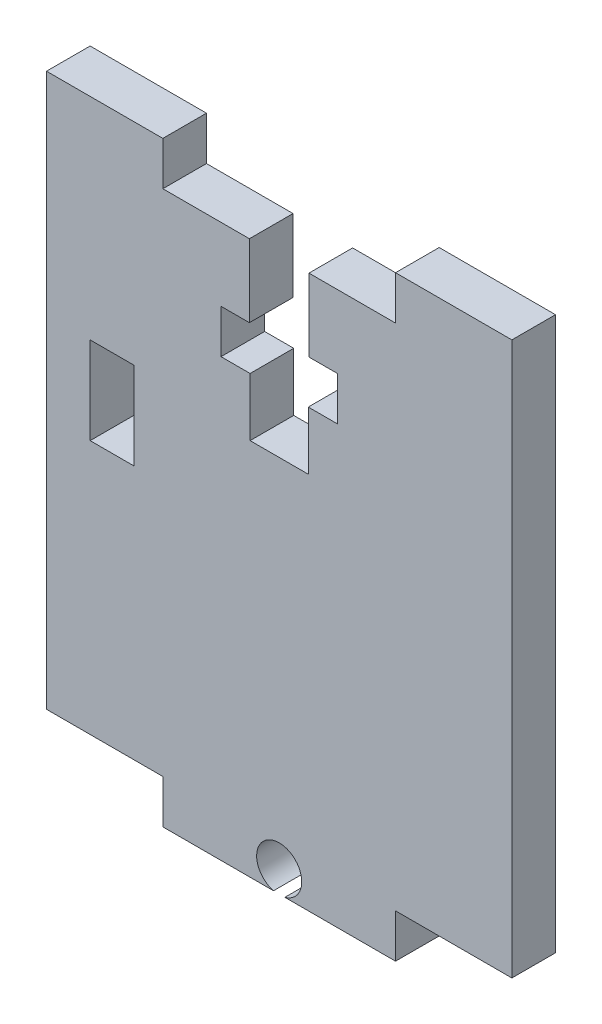
ISO-10303-21;
HEADER;
FILE_DESCRIPTION(('STEP AP214'),'2;1');
FILE_NAME('part.step','',(''),(''),'','','');
FILE_SCHEMA(('AUTOMOTIVE_DESIGN { 1 0 10303 214 1 1 1 1 }'));
ENDSEC;
DATA;
#1=APPLICATION_CONTEXT('core data for automotive mechanical design processes');
#2=APPLICATION_PROTOCOL_DEFINITION('international standard','automotive_design',2000,#1);
#3=PRODUCT_CONTEXT('',#1,'mechanical');
#4=PRODUCT('Part','Part','',(#3));
#5=PRODUCT_RELATED_PRODUCT_CATEGORY('part','',(#4));
#6=PRODUCT_DEFINITION_FORMATION('','',#4);
#7=PRODUCT_DEFINITION_CONTEXT('part definition',#1,'design');
#8=PRODUCT_DEFINITION('design','',#6,#7);
#9=PRODUCT_DEFINITION_SHAPE('','',#8);
#10=(LENGTH_UNIT() NAMED_UNIT(*) SI_UNIT(.MILLI.,.METRE.));
#11=(NAMED_UNIT(*) PLANE_ANGLE_UNIT() SI_UNIT($,.RADIAN.));
#12=(NAMED_UNIT(*) SI_UNIT($,.STERADIAN.) SOLID_ANGLE_UNIT());
#13=UNCERTAINTY_MEASURE_WITH_UNIT(LENGTH_MEASURE(1.E-05),#10,'distance_accuracy_value','');
#14=(GEOMETRIC_REPRESENTATION_CONTEXT(3) GLOBAL_UNCERTAINTY_ASSIGNED_CONTEXT((#13)) GLOBAL_UNIT_ASSIGNED_CONTEXT((#10,
#11,#12)) REPRESENTATION_CONTEXT('',''));
#15=CARTESIAN_POINT('',(0.,0.,0.));
#16=DIRECTION('',(0.,0.,1.));
#17=DIRECTION('',(1.,0.,0.));
#18=AXIS2_PLACEMENT_3D('',#15,#16,#17);
#19=CARTESIAN_POINT('',(0.,12.3553054771042,3.));
#20=DIRECTION('',(0.,0.,1.));
#21=DIRECTION('',(1.,0.,0.));
#22=AXIS2_PLACEMENT_3D('',#19,#20,#21);
#23=PLANE('',#22);
#24=DIRECTION('',(0.,-1.,0.));
#25=VECTOR('',#24,1.);
#26=CARTESIAN_POINT('',(8.,48.8553054771042,3.));
#27=LINE('',#26,#25);
#28=CARTESIAN_POINT('',(8.,51.8553054771042,3.));
#29=VERTEX_POINT('',#28);
#30=CARTESIAN_POINT('',(8.,48.8553054771042,3.));
#31=VERTEX_POINT('',#30);
#32=EDGE_CURVE('E266',#29,#31,#27,.T.);
#33=ORIENTED_EDGE('',*,*,#32,.T.);
#34=DIRECTION('',(-1.,0.,0.));
#35=VECTOR('',#34,1.);
#36=CARTESIAN_POINT('',(2.04789002341845,48.8553054771042,3.));
#37=LINE('',#36,#35);
#38=CARTESIAN_POINT('',(2.04789002341845,48.8553054771042,3.));
#39=VERTEX_POINT('',#38);
#40=EDGE_CURVE('E269',#31,#39,#37,.T.);
#41=ORIENTED_EDGE('',*,*,#40,.T.);
#42=DIRECTION('',(0.,-1.,0.));
#43=VECTOR('',#42,1.);
#44=CARTESIAN_POINT('',(2.04789002341845,48.8553054771042,3.));
#45=LINE('',#44,#43);
#46=CARTESIAN_POINT('',(2.04789002341845,43.8553054771042,3.));
#47=VERTEX_POINT('',#46);
#48=EDGE_CURVE('E272',#39,#47,#45,.T.);
#49=ORIENTED_EDGE('',*,*,#48,.T.);
#50=DIRECTION('',(1.,0.,0.));
#51=VECTOR('',#50,1.);
#52=CARTESIAN_POINT('',(2.04789002341845,43.8553054771042,3.));
#53=LINE('',#52,#51);
#54=CARTESIAN_POINT('',(4.,43.8553054771042,3.));
#55=VERTEX_POINT('',#54);
#56=EDGE_CURVE('E274',#47,#55,#53,.T.);
#57=ORIENTED_EDGE('',*,*,#56,.T.);
#58=DIRECTION('',(0.,-1.,0.));
#59=VECTOR('',#58,1.);
#60=CARTESIAN_POINT('',(4.,43.8553054771042,3.));
#61=LINE('',#60,#59);
#62=CARTESIAN_POINT('',(4.,40.8553054771042,3.));
#63=VERTEX_POINT('',#62);
#64=EDGE_CURVE('E276',#55,#63,#61,.T.);
#65=ORIENTED_EDGE('',*,*,#64,.T.);
#66=DIRECTION('',(-1.,0.,0.));
#67=VECTOR('',#66,1.);
#68=CARTESIAN_POINT('',(4.,40.8553054771042,3.));
#69=LINE('',#68,#67);
#70=CARTESIAN_POINT('',(2.,40.8553054771042,3.));
#71=VERTEX_POINT('',#70);
#72=EDGE_CURVE('E278',#63,#71,#69,.T.);
#73=ORIENTED_EDGE('',*,*,#72,.T.);
#74=DIRECTION('',(0.,-1.,0.));
#75=VECTOR('',#74,1.);
#76=CARTESIAN_POINT('',(2.,40.8553054771042,3.));
#77=LINE('',#76,#75);
#78=CARTESIAN_POINT('',(2.,36.8553054771042,3.));
#79=VERTEX_POINT('',#78);
#80=EDGE_CURVE('E280',#71,#79,#77,.T.);
#81=ORIENTED_EDGE('',*,*,#80,.T.);
#82=DIRECTION('',(-1.,0.,0.));
#83=VECTOR('',#82,1.);
#84=CARTESIAN_POINT('',(2.,36.8553054771042,3.));
#85=LINE('',#84,#83);
#86=CARTESIAN_POINT('',(-2.,36.8553054771042,3.));
#87=VERTEX_POINT('',#86);
#88=EDGE_CURVE('E282',#79,#87,#85,.T.);
#89=ORIENTED_EDGE('',*,*,#88,.T.);
#90=DIRECTION('',(0.,1.,0.));
#91=VECTOR('',#90,1.);
#92=CARTESIAN_POINT('',(-2.,40.8553054771042,3.));
#93=LINE('',#92,#91);
#94=CARTESIAN_POINT('',(-2.,40.8553054771042,3.));
#95=VERTEX_POINT('',#94);
#96=EDGE_CURVE('E284',#87,#95,#93,.T.);
#97=ORIENTED_EDGE('',*,*,#96,.T.);
#98=DIRECTION('',(-1.,0.,0.));
#99=VECTOR('',#98,1.);
#100=CARTESIAN_POINT('',(-4.00000000000001,40.8553054771042,3.));
#101=LINE('',#100,#99);
#102=CARTESIAN_POINT('',(-4.00000000000001,40.8553054771042,3.));
#103=VERTEX_POINT('',#102);
#104=EDGE_CURVE('E286',#95,#103,#101,.T.);
#105=ORIENTED_EDGE('',*,*,#104,.T.);
#106=DIRECTION('',(0.,1.,0.));
#107=VECTOR('',#106,1.);
#108=CARTESIAN_POINT('',(-4.,43.8553054771042,3.));
#109=LINE('',#108,#107);
#110=CARTESIAN_POINT('',(-4.,43.8553054771042,3.));
#111=VERTEX_POINT('',#110);
#112=EDGE_CURVE('E288',#103,#111,#109,.T.);
#113=ORIENTED_EDGE('',*,*,#112,.T.);
#114=DIRECTION('',(1.,0.,0.));
#115=VECTOR('',#114,1.);
#116=CARTESIAN_POINT('',(-2.04789002341846,43.8553054771042,3.));
#117=LINE('',#116,#115);
#118=CARTESIAN_POINT('',(-2.04789002341846,43.8553054771042,3.));
#119=VERTEX_POINT('',#118);
#120=EDGE_CURVE('E290',#111,#119,#117,.T.);
#121=ORIENTED_EDGE('',*,*,#120,.T.);
#122=DIRECTION('',(0.,1.,0.));
#123=VECTOR('',#122,1.);
#124=CARTESIAN_POINT('',(-2.04789002341846,48.8553054771042,3.));
#125=LINE('',#124,#123);
#126=CARTESIAN_POINT('',(-2.04789002341846,48.8553054771042,3.));
#127=VERTEX_POINT('',#126);
#128=EDGE_CURVE('E292',#119,#127,#125,.T.);
#129=ORIENTED_EDGE('',*,*,#128,.T.);
#130=DIRECTION('',(-1.,0.,0.));
#131=VECTOR('',#130,1.);
#132=CARTESIAN_POINT('',(-2.04789002341846,48.8553054771042,3.));
#133=LINE('',#132,#131);
#134=CARTESIAN_POINT('',(-8.00000000000001,48.8553054771042,3.));
#135=VERTEX_POINT('',#134);
#136=EDGE_CURVE('E294',#127,#135,#133,.T.);
#137=ORIENTED_EDGE('',*,*,#136,.T.);
#138=DIRECTION('',(0.,1.,0.));
#139=VECTOR('',#138,1.);
#140=CARTESIAN_POINT('',(-8.00000000000001,48.8553054771042,3.));
#141=LINE('',#140,#139);
#142=CARTESIAN_POINT('',(-8.00000000000001,51.8553054771042,3.));
#143=VERTEX_POINT('',#142);
#144=EDGE_CURVE('E296',#135,#143,#141,.T.);
#145=ORIENTED_EDGE('',*,*,#144,.T.);
#146=DIRECTION('',(-1.,0.,0.));
#147=VECTOR('',#146,1.);
#148=CARTESIAN_POINT('',(-8.00000000000001,51.8553054771042,3.));
#149=LINE('',#148,#147);
#150=CARTESIAN_POINT('',(-16.,51.8553054771042,3.));
#151=VERTEX_POINT('',#150);
#152=EDGE_CURVE('E298',#143,#151,#149,.T.);
#153=ORIENTED_EDGE('',*,*,#152,.T.);
#154=DIRECTION('',(0.,-1.,0.));
#155=VECTOR('',#154,1.);
#156=CARTESIAN_POINT('',(-16.,51.8553054771042,3.));
#157=LINE('',#156,#155);
#158=CARTESIAN_POINT('',(-16.,13.8553054771042,3.));
#159=VERTEX_POINT('',#158);
#160=EDGE_CURVE('E300',#151,#159,#157,.T.);
#161=ORIENTED_EDGE('',*,*,#160,.T.);
#162=DIRECTION('',(1.,0.,0.));
#163=VECTOR('',#162,1.);
#164=CARTESIAN_POINT('',(-16.,13.8553054771042,3.));
#165=LINE('',#164,#163);
#166=CARTESIAN_POINT('',(-8.00000000000001,13.8553054771042,3.));
#167=VERTEX_POINT('',#166);
#168=EDGE_CURVE('E302',#159,#167,#165,.T.);
#169=ORIENTED_EDGE('',*,*,#168,.T.);
#170=DIRECTION('',(0.,-1.,0.));
#171=VECTOR('',#170,1.);
#172=CARTESIAN_POINT('',(-8.00000000000001,10.8553054771042,3.));
#173=LINE('',#172,#171);
#174=CARTESIAN_POINT('',(-8.00000000000001,10.8553054771042,3.));
#175=VERTEX_POINT('',#174);
#176=EDGE_CURVE('E304',#167,#175,#173,.T.);
#177=ORIENTED_EDGE('',*,*,#176,.T.);
#178=DIRECTION('',(1.,0.,0.));
#179=VECTOR('',#178,1.);
#180=CARTESIAN_POINT('',(-8.00000000000001,10.8553054771042,3.));
#181=LINE('',#180,#179);
#182=CARTESIAN_POINT('',(-0.390512483795337,10.8553054771042,3.));
#183=VERTEX_POINT('',#182);
#184=EDGE_CURVE('E306',#175,#183,#181,.T.);
#185=ORIENTED_EDGE('',*,*,#184,.T.);
#186=CARTESIAN_POINT('',(0.,12.3553054771042,3.));
#187=DIRECTION('',(0.,0.,-1.));
#188=DIRECTION('',(1.,0.,0.));
#189=AXIS2_PLACEMENT_3D('',#186,#187,#188);
#190=CIRCLE('',#189,1.55);
#191=CARTESIAN_POINT('',(0.390512483795359,10.8553054771042,3.));
#192=VERTEX_POINT('',#191);
#193=EDGE_CURVE('E308',#183,#192,#190,.T.);
#194=ORIENTED_EDGE('',*,*,#193,.T.);
#195=DIRECTION('',(1.,0.,0.));
#196=VECTOR('',#195,1.);
#197=CARTESIAN_POINT('',(0.39051248379536,10.8553054771042,3.));
#198=LINE('',#197,#196);
#199=CARTESIAN_POINT('',(8.00000000000003,10.8553054771042,3.));
#200=VERTEX_POINT('',#199);
#201=EDGE_CURVE('E310',#192,#200,#198,.T.);
#202=ORIENTED_EDGE('',*,*,#201,.T.);
#203=DIRECTION('',(0.,1.,0.));
#204=VECTOR('',#203,1.);
#205=CARTESIAN_POINT('',(8.00000000000003,10.8553054771042,3.));
#206=LINE('',#205,#204);
#207=CARTESIAN_POINT('',(8.00000000000004,13.8553054771042,3.));
#208=VERTEX_POINT('',#207);
#209=EDGE_CURVE('E312',#200,#208,#206,.T.);
#210=ORIENTED_EDGE('',*,*,#209,.T.);
#211=DIRECTION('',(1.,0.,0.));
#212=VECTOR('',#211,1.);
#213=CARTESIAN_POINT('',(16.,13.8553054771042,3.));
#214=LINE('',#213,#212);
#215=CARTESIAN_POINT('',(16.,13.8553054771042,3.));
#216=VERTEX_POINT('',#215);
#217=EDGE_CURVE('E314',#208,#216,#214,.T.);
#218=ORIENTED_EDGE('',*,*,#217,.T.);
#219=DIRECTION('',(0.,1.,0.));
#220=VECTOR('',#219,1.);
#221=CARTESIAN_POINT('',(16.,51.8553054771042,3.));
#222=LINE('',#221,#220);
#223=CARTESIAN_POINT('',(16.,51.8553054771042,3.));
#224=VERTEX_POINT('',#223);
#225=EDGE_CURVE('E316',#216,#224,#222,.T.);
#226=ORIENTED_EDGE('',*,*,#225,.T.);
#227=DIRECTION('',(-1.,0.,0.));
#228=VECTOR('',#227,1.);
#229=CARTESIAN_POINT('',(8.,51.8553054771042,3.));
#230=LINE('',#229,#228);
#231=EDGE_CURVE('E318',#224,#29,#230,.T.);
#232=ORIENTED_EDGE('',*,*,#231,.T.);
#233=EDGE_LOOP('',(#33,#41,#49,#57,#65,#73,#81,#89,#97,#105,#113,#121,#129,#137,#145,#153,#161,
#169,#177,#185,#194,#202,#210,#218,#226,#232));
#234=FACE_BOUND('',#233,.T.);
#235=DIRECTION('',(1.,0.,0.));
#236=VECTOR('',#235,1.);
#237=CARTESIAN_POINT('',(-13.,31.3553054771042,3.));
#238=LINE('',#237,#236);
#239=CARTESIAN_POINT('',(-13.,31.3553054771042,3.));
#240=VERTEX_POINT('',#239);
#241=CARTESIAN_POINT('',(-9.99999999999999,31.3553054771042,3.));
#242=VERTEX_POINT('',#241);
#243=EDGE_CURVE('E238',#240,#242,#238,.T.);
#244=ORIENTED_EDGE('',*,*,#243,.F.);
#245=DIRECTION('',(0.,-1.,0.));
#246=VECTOR('',#245,1.);
#247=CARTESIAN_POINT('',(-13.,31.3553054771042,3.));
#248=LINE('',#247,#246);
#249=CARTESIAN_POINT('',(-13.,37.3553054771042,3.));
#250=VERTEX_POINT('',#249);
#251=EDGE_CURVE('E230',#250,#240,#248,.T.);
#252=ORIENTED_EDGE('',*,*,#251,.F.);
#253=DIRECTION('',(-1.,0.,0.));
#254=VECTOR('',#253,1.);
#255=CARTESIAN_POINT('',(-13.,37.3553054771042,3.));
#256=LINE('',#255,#254);
#257=CARTESIAN_POINT('',(-9.99999999999999,37.3553054771042,3.));
#258=VERTEX_POINT('',#257);
#259=EDGE_CURVE('E252',#258,#250,#256,.T.);
#260=ORIENTED_EDGE('',*,*,#259,.F.);
#261=DIRECTION('',(0.,1.,0.));
#262=VECTOR('',#261,1.);
#263=CARTESIAN_POINT('',(-9.99999999999999,31.3553054771042,3.));
#264=LINE('',#263,#262);
#265=EDGE_CURVE('E250',#242,#258,#264,.T.);
#266=ORIENTED_EDGE('',*,*,#265,.F.);
#267=EDGE_LOOP('',(#244,#252,#260,#266));
#268=FACE_BOUND('',#267,.T.);
#269=ADVANCED_FACE('F33',(#234,#268),#23,.T.);
#270=CARTESIAN_POINT('',(0.,12.3553054771042,0.));
#271=DIRECTION('',(0.,0.,1.));
#272=DIRECTION('',(1.,0.,0.));
#273=AXIS2_PLACEMENT_3D('',#270,#271,#272);
#274=PLANE('',#273);
#275=DIRECTION('',(0.,-1.,0.));
#276=VECTOR('',#275,1.);
#277=CARTESIAN_POINT('',(8.,48.8553054771042,0.));
#278=LINE('',#277,#276);
#279=CARTESIAN_POINT('',(8.,51.8553054771042,0.));
#280=VERTEX_POINT('',#279);
#281=CARTESIAN_POINT('',(8.,48.8553054771042,0.));
#282=VERTEX_POINT('',#281);
#283=EDGE_CURVE('E246',#280,#282,#278,.T.);
#284=ORIENTED_EDGE('',*,*,#283,.F.);
#285=DIRECTION('',(-1.,0.,0.));
#286=VECTOR('',#285,1.);
#287=CARTESIAN_POINT('',(8.,51.8553054771042,0.));
#288=LINE('',#287,#286);
#289=CARTESIAN_POINT('',(16.,51.8553054771042,0.));
#290=VERTEX_POINT('',#289);
#291=EDGE_CURVE('E270',#290,#280,#288,.T.);
#292=ORIENTED_EDGE('',*,*,#291,.F.);
#293=DIRECTION('',(0.,1.,0.));
#294=VECTOR('',#293,1.);
#295=CARTESIAN_POINT('',(16.,51.8553054771042,0.));
#296=LINE('',#295,#294);
#297=CARTESIAN_POINT('',(16.,13.8553054771042,0.));
#298=VERTEX_POINT('',#297);
#299=EDGE_CURVE('E369',#298,#290,#296,.T.);
#300=ORIENTED_EDGE('',*,*,#299,.F.);
#301=DIRECTION('',(1.,0.,0.));
#302=VECTOR('',#301,1.);
#303=CARTESIAN_POINT('',(16.,13.8553054771042,0.));
#304=LINE('',#303,#302);
#305=CARTESIAN_POINT('',(8.00000000000004,13.8553054771042,0.));
#306=VERTEX_POINT('',#305);
#307=EDGE_CURVE('E367',#306,#298,#304,.T.);
#308=ORIENTED_EDGE('',*,*,#307,.F.);
#309=DIRECTION('',(0.,1.,0.));
#310=VECTOR('',#309,1.);
#311=CARTESIAN_POINT('',(8.00000000000003,10.8553054771042,0.));
#312=LINE('',#311,#310);
#313=CARTESIAN_POINT('',(8.00000000000003,10.8553054771042,0.));
#314=VERTEX_POINT('',#313);
#315=EDGE_CURVE('E365',#314,#306,#312,.T.);
#316=ORIENTED_EDGE('',*,*,#315,.F.);
#317=DIRECTION('',(1.,0.,0.));
#318=VECTOR('',#317,1.);
#319=CARTESIAN_POINT('',(0.39051248379536,10.8553054771042,0.));
#320=LINE('',#319,#318);
#321=CARTESIAN_POINT('',(0.390512483795359,10.8553054771042,0.));
#322=VERTEX_POINT('',#321);
#323=EDGE_CURVE('E363',#322,#314,#320,.T.);
#324=ORIENTED_EDGE('',*,*,#323,.F.);
#325=CARTESIAN_POINT('',(0.,12.3553054771042,0.));
#326=DIRECTION('',(0.,0.,-1.));
#327=DIRECTION('',(1.,0.,0.));
#328=AXIS2_PLACEMENT_3D('',#325,#326,#327);
#329=CIRCLE('',#328,1.55);
#330=CARTESIAN_POINT('',(-0.390512483795337,10.8553054771042,0.));
#331=VERTEX_POINT('',#330);
#332=EDGE_CURVE('E361',#331,#322,#329,.T.);
#333=ORIENTED_EDGE('',*,*,#332,.F.);
#334=DIRECTION('',(1.,0.,0.));
#335=VECTOR('',#334,1.);
#336=CARTESIAN_POINT('',(-8.00000000000001,10.8553054771042,0.));
#337=LINE('',#336,#335);
#338=CARTESIAN_POINT('',(-8.00000000000001,10.8553054771042,0.));
#339=VERTEX_POINT('',#338);
#340=EDGE_CURVE('E359',#339,#331,#337,.T.);
#341=ORIENTED_EDGE('',*,*,#340,.F.);
#342=DIRECTION('',(0.,-1.,0.));
#343=VECTOR('',#342,1.);
#344=CARTESIAN_POINT('',(-8.00000000000001,10.8553054771042,0.));
#345=LINE('',#344,#343);
#346=CARTESIAN_POINT('',(-8.00000000000001,13.8553054771042,0.));
#347=VERTEX_POINT('',#346);
#348=EDGE_CURVE('E357',#347,#339,#345,.T.);
#349=ORIENTED_EDGE('',*,*,#348,.F.);
#350=DIRECTION('',(1.,0.,0.));
#351=VECTOR('',#350,1.);
#352=CARTESIAN_POINT('',(-16.,13.8553054771042,0.));
#353=LINE('',#352,#351);
#354=CARTESIAN_POINT('',(-16.,13.8553054771042,0.));
#355=VERTEX_POINT('',#354);
#356=EDGE_CURVE('E355',#355,#347,#353,.T.);
#357=ORIENTED_EDGE('',*,*,#356,.F.);
#358=DIRECTION('',(0.,-1.,0.));
#359=VECTOR('',#358,1.);
#360=CARTESIAN_POINT('',(-16.,51.8553054771042,0.));
#361=LINE('',#360,#359);
#362=CARTESIAN_POINT('',(-16.,51.8553054771042,0.));
#363=VERTEX_POINT('',#362);
#364=EDGE_CURVE('E353',#363,#355,#361,.T.);
#365=ORIENTED_EDGE('',*,*,#364,.F.);
#366=DIRECTION('',(-1.,0.,0.));
#367=VECTOR('',#366,1.);
#368=CARTESIAN_POINT('',(-8.00000000000001,51.8553054771042,0.));
#369=LINE('',#368,#367);
#370=CARTESIAN_POINT('',(-8.00000000000001,51.8553054771042,0.));
#371=VERTEX_POINT('',#370);
#372=EDGE_CURVE('E351',#371,#363,#369,.T.);
#373=ORIENTED_EDGE('',*,*,#372,.F.);
#374=DIRECTION('',(0.,1.,0.));
#375=VECTOR('',#374,1.);
#376=CARTESIAN_POINT('',(-8.00000000000001,48.8553054771042,0.));
#377=LINE('',#376,#375);
#378=CARTESIAN_POINT('',(-8.00000000000001,48.8553054771042,0.));
#379=VERTEX_POINT('',#378);
#380=EDGE_CURVE('E349',#379,#371,#377,.T.);
#381=ORIENTED_EDGE('',*,*,#380,.F.);
#382=DIRECTION('',(-1.,0.,0.));
#383=VECTOR('',#382,1.);
#384=CARTESIAN_POINT('',(-2.04789002341846,48.8553054771042,0.));
#385=LINE('',#384,#383);
#386=CARTESIAN_POINT('',(-2.04789002341846,48.8553054771042,0.));
#387=VERTEX_POINT('',#386);
#388=EDGE_CURVE('E347',#387,#379,#385,.T.);
#389=ORIENTED_EDGE('',*,*,#388,.F.);
#390=DIRECTION('',(0.,1.,0.));
#391=VECTOR('',#390,1.);
#392=CARTESIAN_POINT('',(-2.04789002341846,48.8553054771042,0.));
#393=LINE('',#392,#391);
#394=CARTESIAN_POINT('',(-2.04789002341846,43.8553054771042,0.));
#395=VERTEX_POINT('',#394);
#396=EDGE_CURVE('E345',#395,#387,#393,.T.);
#397=ORIENTED_EDGE('',*,*,#396,.F.);
#398=DIRECTION('',(1.,0.,0.));
#399=VECTOR('',#398,1.);
#400=CARTESIAN_POINT('',(-2.04789002341846,43.8553054771042,0.));
#401=LINE('',#400,#399);
#402=CARTESIAN_POINT('',(-4.,43.8553054771042,0.));
#403=VERTEX_POINT('',#402);
#404=EDGE_CURVE('E343',#403,#395,#401,.T.);
#405=ORIENTED_EDGE('',*,*,#404,.F.);
#406=DIRECTION('',(0.,1.,0.));
#407=VECTOR('',#406,1.);
#408=CARTESIAN_POINT('',(-4.,43.8553054771042,0.));
#409=LINE('',#408,#407);
#410=CARTESIAN_POINT('',(-4.00000000000001,40.8553054771042,0.));
#411=VERTEX_POINT('',#410);
#412=EDGE_CURVE('E341',#411,#403,#409,.T.);
#413=ORIENTED_EDGE('',*,*,#412,.F.);
#414=DIRECTION('',(-1.,0.,0.));
#415=VECTOR('',#414,1.);
#416=CARTESIAN_POINT('',(-4.00000000000001,40.8553054771042,0.));
#417=LINE('',#416,#415);
#418=CARTESIAN_POINT('',(-2.,40.8553054771042,0.));
#419=VERTEX_POINT('',#418);
#420=EDGE_CURVE('E339',#419,#411,#417,.T.);
#421=ORIENTED_EDGE('',*,*,#420,.F.);
#422=DIRECTION('',(0.,1.,0.));
#423=VECTOR('',#422,1.);
#424=CARTESIAN_POINT('',(-2.,40.8553054771042,0.));
#425=LINE('',#424,#423);
#426=CARTESIAN_POINT('',(-2.,36.8553054771042,0.));
#427=VERTEX_POINT('',#426);
#428=EDGE_CURVE('E337',#427,#419,#425,.T.);
#429=ORIENTED_EDGE('',*,*,#428,.F.);
#430=DIRECTION('',(-1.,0.,0.));
#431=VECTOR('',#430,1.);
#432=CARTESIAN_POINT('',(2.,36.8553054771042,0.));
#433=LINE('',#432,#431);
#434=CARTESIAN_POINT('',(2.,36.8553054771042,0.));
#435=VERTEX_POINT('',#434);
#436=EDGE_CURVE('E335',#435,#427,#433,.T.);
#437=ORIENTED_EDGE('',*,*,#436,.F.);
#438=DIRECTION('',(0.,-1.,0.));
#439=VECTOR('',#438,1.);
#440=CARTESIAN_POINT('',(2.,40.8553054771042,0.));
#441=LINE('',#440,#439);
#442=CARTESIAN_POINT('',(2.,40.8553054771042,0.));
#443=VERTEX_POINT('',#442);
#444=EDGE_CURVE('E333',#443,#435,#441,.T.);
#445=ORIENTED_EDGE('',*,*,#444,.F.);
#446=DIRECTION('',(-1.,0.,0.));
#447=VECTOR('',#446,1.);
#448=CARTESIAN_POINT('',(4.,40.8553054771042,0.));
#449=LINE('',#448,#447);
#450=CARTESIAN_POINT('',(4.,40.8553054771042,0.));
#451=VERTEX_POINT('',#450);
#452=EDGE_CURVE('E331',#451,#443,#449,.T.);
#453=ORIENTED_EDGE('',*,*,#452,.F.);
#454=DIRECTION('',(0.,-1.,0.));
#455=VECTOR('',#454,1.);
#456=CARTESIAN_POINT('',(4.,43.8553054771042,0.));
#457=LINE('',#456,#455);
#458=CARTESIAN_POINT('',(4.,43.8553054771042,0.));
#459=VERTEX_POINT('',#458);
#460=EDGE_CURVE('E329',#459,#451,#457,.T.);
#461=ORIENTED_EDGE('',*,*,#460,.F.);
#462=DIRECTION('',(1.,0.,0.));
#463=VECTOR('',#462,1.);
#464=CARTESIAN_POINT('',(2.04789002341845,43.8553054771042,0.));
#465=LINE('',#464,#463);
#466=CARTESIAN_POINT('',(2.04789002341845,43.8553054771042,0.));
#467=VERTEX_POINT('',#466);
#468=EDGE_CURVE('E327',#467,#459,#465,.T.);
#469=ORIENTED_EDGE('',*,*,#468,.F.);
#470=DIRECTION('',(0.,-1.,0.));
#471=VECTOR('',#470,1.);
#472=CARTESIAN_POINT('',(2.04789002341845,48.8553054771042,0.));
#473=LINE('',#472,#471);
#474=CARTESIAN_POINT('',(2.04789002341845,48.8553054771042,0.));
#475=VERTEX_POINT('',#474);
#476=EDGE_CURVE('E325',#475,#467,#473,.T.);
#477=ORIENTED_EDGE('',*,*,#476,.F.);
#478=DIRECTION('',(-1.,0.,0.));
#479=VECTOR('',#478,1.);
#480=CARTESIAN_POINT('',(2.04789002341845,48.8553054771042,0.));
#481=LINE('',#480,#479);
#482=EDGE_CURVE('E323',#282,#475,#481,.T.);
#483=ORIENTED_EDGE('',*,*,#482,.F.);
#484=EDGE_LOOP('',(#284,#292,#300,#308,#316,#324,#333,#341,#349,#357,#365,#373,#381,#389,#397,
#405,#413,#421,#429,#437,#445,#453,#461,#469,#477,#483));
#485=FACE_BOUND('',#484,.T.);
#486=DIRECTION('',(0.,-1.,0.));
#487=VECTOR('',#486,1.);
#488=CARTESIAN_POINT('',(-13.,31.3553054771042,0.));
#489=LINE('',#488,#487);
#490=CARTESIAN_POINT('',(-13.,37.3553054771042,0.));
#491=VERTEX_POINT('',#490);
#492=CARTESIAN_POINT('',(-13.,31.3553054771042,0.));
#493=VERTEX_POINT('',#492);
#494=EDGE_CURVE('E56',#491,#493,#489,.T.);
#495=ORIENTED_EDGE('',*,*,#494,.T.);
#496=DIRECTION('',(1.,0.,0.));
#497=VECTOR('',#496,1.);
#498=CARTESIAN_POINT('',(-13.,31.3553054771042,0.));
#499=LINE('',#498,#497);
#500=CARTESIAN_POINT('',(-9.99999999999999,31.3553054771042,0.));
#501=VERTEX_POINT('',#500);
#502=EDGE_CURVE('E245',#493,#501,#499,.T.);
#503=ORIENTED_EDGE('',*,*,#502,.T.);
#504=DIRECTION('',(0.,1.,0.));
#505=VECTOR('',#504,1.);
#506=CARTESIAN_POINT('',(-9.99999999999999,31.3553054771042,0.));
#507=LINE('',#506,#505);
#508=CARTESIAN_POINT('',(-9.99999999999999,37.3553054771042,0.));
#509=VERTEX_POINT('',#508);
#510=EDGE_CURVE('E258',#501,#509,#507,.T.);
#511=ORIENTED_EDGE('',*,*,#510,.T.);
#512=DIRECTION('',(-1.,0.,0.));
#513=VECTOR('',#512,1.);
#514=CARTESIAN_POINT('',(-13.,37.3553054771042,0.));
#515=LINE('',#514,#513);
#516=EDGE_CURVE('E239',#509,#491,#515,.T.);
#517=ORIENTED_EDGE('',*,*,#516,.T.);
#518=EDGE_LOOP('',(#495,#503,#511,#517));
#519=FACE_BOUND('',#518,.T.);
#520=ADVANCED_FACE('F453',(#485,#519),#274,.F.);
#521=CARTESIAN_POINT('',(8.,48.8553054771042,3.));
#522=DIRECTION('',(1.,0.,0.));
#523=DIRECTION('',(0.,0.,-1.));
#524=AXIS2_PLACEMENT_3D('',#521,#522,#523);
#525=PLANE('',#524);
#526=ORIENTED_EDGE('',*,*,#283,.T.);
#527=DIRECTION('',(0.,0.,-1.));
#528=VECTOR('',#527,1.);
#529=CARTESIAN_POINT('',(8.,48.8553054771042,3.));
#530=LINE('',#529,#528);
#531=EDGE_CURVE('E11',#31,#282,#530,.T.);
#532=ORIENTED_EDGE('',*,*,#531,.F.);
#533=ORIENTED_EDGE('',*,*,#32,.F.);
#534=DIRECTION('',(0.,0.,-1.));
#535=VECTOR('',#534,1.);
#536=CARTESIAN_POINT('',(8.,51.8553054771042,3.));
#537=LINE('',#536,#535);
#538=EDGE_CURVE('E320',#29,#280,#537,.T.);
#539=ORIENTED_EDGE('',*,*,#538,.T.);
#540=EDGE_LOOP('',(#526,#532,#533,#539));
#541=FACE_BOUND('',#540,.T.);
#542=ADVANCED_FACE('F35',(#541),#525,.F.);
#543=CARTESIAN_POINT('',(2.04789002341845,48.8553054771042,3.));
#544=DIRECTION('',(0.,-1.,0.));
#545=DIRECTION('',(0.,0.,-1.));
#546=AXIS2_PLACEMENT_3D('',#543,#544,#545);
#547=PLANE('',#546);
#548=ORIENTED_EDGE('',*,*,#482,.T.);
#549=DIRECTION('',(0.,0.,-1.));
#550=VECTOR('',#549,1.);
#551=CARTESIAN_POINT('',(2.04789002341845,48.8553054771042,3.));
#552=LINE('',#551,#550);
#553=EDGE_CURVE('E41',#39,#475,#552,.T.);
#554=ORIENTED_EDGE('',*,*,#553,.F.);
#555=ORIENTED_EDGE('',*,*,#40,.F.);
#556=ORIENTED_EDGE('',*,*,#531,.T.);
#557=EDGE_LOOP('',(#548,#554,#555,#556));
#558=FACE_BOUND('',#557,.T.);
#559=ADVANCED_FACE('F470',(#558),#547,.F.);
#560=CARTESIAN_POINT('',(2.04789002341845,48.8553054771042,3.));
#561=DIRECTION('',(1.,0.,0.));
#562=DIRECTION('',(0.,1.,0.));
#563=AXIS2_PLACEMENT_3D('',#560,#561,#562);
#564=PLANE('',#563);
#565=ORIENTED_EDGE('',*,*,#476,.T.);
#566=DIRECTION('',(0.,0.,-1.));
#567=VECTOR('',#566,1.);
#568=CARTESIAN_POINT('',(2.04789002341845,43.8553054771042,3.));
#569=LINE('',#568,#567);
#570=EDGE_CURVE('E440',#47,#467,#569,.T.);
#571=ORIENTED_EDGE('',*,*,#570,.F.);
#572=ORIENTED_EDGE('',*,*,#48,.F.);
#573=ORIENTED_EDGE('',*,*,#553,.T.);
#574=EDGE_LOOP('',(#565,#571,#572,#573));
#575=FACE_BOUND('',#574,.T.);
#576=ADVANCED_FACE('F447',(#575),#564,.F.);
#577=CARTESIAN_POINT('',(2.04789002341845,43.8553054771042,3.));
#578=DIRECTION('',(0.,1.,0.));
#579=DIRECTION('',(-1.,0.,0.));
#580=AXIS2_PLACEMENT_3D('',#577,#578,#579);
#581=PLANE('',#580);
#582=ORIENTED_EDGE('',*,*,#468,.T.);
#583=DIRECTION('',(0.,0.,-1.));
#584=VECTOR('',#583,1.);
#585=CARTESIAN_POINT('',(4.,43.8553054771042,3.));
#586=LINE('',#585,#584);
#587=EDGE_CURVE('E437',#55,#459,#586,.T.);
#588=ORIENTED_EDGE('',*,*,#587,.F.);
#589=ORIENTED_EDGE('',*,*,#56,.F.);
#590=ORIENTED_EDGE('',*,*,#570,.T.);
#591=EDGE_LOOP('',(#582,#588,#589,#590));
#592=FACE_BOUND('',#591,.T.);
#593=ADVANCED_FACE('F459',(#592),#581,.F.);
#594=CARTESIAN_POINT('',(4.,43.8553054771042,3.));
#595=DIRECTION('',(1.,0.,0.));
#596=DIRECTION('',(0.,1.,0.));
#597=AXIS2_PLACEMENT_3D('',#594,#595,#596);
#598=PLANE('',#597);
#599=ORIENTED_EDGE('',*,*,#460,.T.);
#600=DIRECTION('',(0.,0.,-1.));
#601=VECTOR('',#600,1.);
#602=CARTESIAN_POINT('',(4.,40.8553054771042,3.));
#603=LINE('',#602,#601);
#604=EDGE_CURVE('E434',#63,#451,#603,.T.);
#605=ORIENTED_EDGE('',*,*,#604,.F.);
#606=ORIENTED_EDGE('',*,*,#64,.F.);
#607=ORIENTED_EDGE('',*,*,#587,.T.);
#608=EDGE_LOOP('',(#599,#605,#606,#607));
#609=FACE_BOUND('',#608,.T.);
#610=ADVANCED_FACE('F463',(#609),#598,.F.);
#611=CARTESIAN_POINT('',(4.,40.8553054771042,3.));
#612=DIRECTION('',(0.,-1.,0.));
#613=DIRECTION('',(0.,0.,-1.));
#614=AXIS2_PLACEMENT_3D('',#611,#612,#613);
#615=PLANE('',#614);
#616=ORIENTED_EDGE('',*,*,#452,.T.);
#617=DIRECTION('',(0.,0.,-1.));
#618=VECTOR('',#617,1.);
#619=CARTESIAN_POINT('',(2.,40.8553054771042,3.));
#620=LINE('',#619,#618);
#621=EDGE_CURVE('E431',#71,#443,#620,.T.);
#622=ORIENTED_EDGE('',*,*,#621,.F.);
#623=ORIENTED_EDGE('',*,*,#72,.F.);
#624=ORIENTED_EDGE('',*,*,#604,.T.);
#625=EDGE_LOOP('',(#616,#622,#623,#624));
#626=FACE_BOUND('',#625,.T.);
#627=ADVANCED_FACE('F573',(#626),#615,.F.);
#628=CARTESIAN_POINT('',(2.,40.8553054771042,3.));
#629=DIRECTION('',(1.,0.,0.));
#630=DIRECTION('',(0.,1.,0.));
#631=AXIS2_PLACEMENT_3D('',#628,#629,#630);
#632=PLANE('',#631);
#633=ORIENTED_EDGE('',*,*,#444,.T.);
#634=DIRECTION('',(0.,0.,-1.));
#635=VECTOR('',#634,1.);
#636=CARTESIAN_POINT('',(2.,36.8553054771042,3.));
#637=LINE('',#636,#635);
#638=EDGE_CURVE('E428',#79,#435,#637,.T.);
#639=ORIENTED_EDGE('',*,*,#638,.F.);
#640=ORIENTED_EDGE('',*,*,#80,.F.);
#641=ORIENTED_EDGE('',*,*,#621,.T.);
#642=EDGE_LOOP('',(#633,#639,#640,#641));
#643=FACE_BOUND('',#642,.T.);
#644=ADVANCED_FACE('F571',(#643),#632,.F.);
#645=CARTESIAN_POINT('',(2.,36.8553054771042,3.));
#646=DIRECTION('',(0.,-1.,0.));
#647=DIRECTION('',(0.,0.,-1.));
#648=AXIS2_PLACEMENT_3D('',#645,#646,#647);
#649=PLANE('',#648);
#650=ORIENTED_EDGE('',*,*,#436,.T.);
#651=DIRECTION('',(0.,0.,-1.));
#652=VECTOR('',#651,1.);
#653=CARTESIAN_POINT('',(-2.,36.8553054771042,3.));
#654=LINE('',#653,#652);
#655=EDGE_CURVE('E425',#87,#427,#654,.T.);
#656=ORIENTED_EDGE('',*,*,#655,.F.);
#657=ORIENTED_EDGE('',*,*,#88,.F.);
#658=ORIENTED_EDGE('',*,*,#638,.T.);
#659=EDGE_LOOP('',(#650,#656,#657,#658));
#660=FACE_BOUND('',#659,.T.);
#661=ADVANCED_FACE('F566',(#660),#649,.F.);
#662=CARTESIAN_POINT('',(-2.,40.8553054771042,3.));
#663=DIRECTION('',(-1.,0.,0.));
#664=DIRECTION('',(0.,-1.,0.));
#665=AXIS2_PLACEMENT_3D('',#662,#663,#664);
#666=PLANE('',#665);
#667=ORIENTED_EDGE('',*,*,#428,.T.);
#668=DIRECTION('',(0.,0.,-1.));
#669=VECTOR('',#668,1.);
#670=CARTESIAN_POINT('',(-2.,40.8553054771042,3.));
#671=LINE('',#670,#669);
#672=EDGE_CURVE('E422',#95,#419,#671,.T.);
#673=ORIENTED_EDGE('',*,*,#672,.F.);
#674=ORIENTED_EDGE('',*,*,#96,.F.);
#675=ORIENTED_EDGE('',*,*,#655,.T.);
#676=EDGE_LOOP('',(#667,#673,#674,#675));
#677=FACE_BOUND('',#676,.T.);
#678=ADVANCED_FACE('F561',(#677),#666,.F.);
#679=CARTESIAN_POINT('',(-4.00000000000001,40.8553054771042,3.));
#680=DIRECTION('',(0.,-1.,0.));
#681=DIRECTION('',(0.,0.,-1.));
#682=AXIS2_PLACEMENT_3D('',#679,#680,#681);
#683=PLANE('',#682);
#684=ORIENTED_EDGE('',*,*,#420,.T.);
#685=DIRECTION('',(0.,0.,-1.));
#686=VECTOR('',#685,1.);
#687=CARTESIAN_POINT('',(-4.00000000000001,40.8553054771042,3.));
#688=LINE('',#687,#686);
#689=EDGE_CURVE('E419',#103,#411,#688,.T.);
#690=ORIENTED_EDGE('',*,*,#689,.F.);
#691=ORIENTED_EDGE('',*,*,#104,.F.);
#692=ORIENTED_EDGE('',*,*,#672,.T.);
#693=EDGE_LOOP('',(#684,#690,#691,#692));
#694=FACE_BOUND('',#693,.T.);
#695=ADVANCED_FACE('F557',(#694),#683,.F.);
#696=CARTESIAN_POINT('',(-4.,43.8553054771042,3.));
#697=DIRECTION('',(-1.,0.,0.));
#698=DIRECTION('',(0.,-1.,0.));
#699=AXIS2_PLACEMENT_3D('',#696,#697,#698);
#700=PLANE('',#699);
#701=ORIENTED_EDGE('',*,*,#412,.T.);
#702=DIRECTION('',(0.,0.,-1.));
#703=VECTOR('',#702,1.);
#704=CARTESIAN_POINT('',(-4.,43.8553054771042,3.));
#705=LINE('',#704,#703);
#706=EDGE_CURVE('E416',#111,#403,#705,.T.);
#707=ORIENTED_EDGE('',*,*,#706,.F.);
#708=ORIENTED_EDGE('',*,*,#112,.F.);
#709=ORIENTED_EDGE('',*,*,#689,.T.);
#710=EDGE_LOOP('',(#701,#707,#708,#709));
#711=FACE_BOUND('',#710,.T.);
#712=ADVANCED_FACE('F552',(#711),#700,.F.);
#713=CARTESIAN_POINT('',(-2.04789002341846,43.8553054771042,3.));
#714=DIRECTION('',(0.,1.,0.));
#715=DIRECTION('',(-1.,0.,0.));
#716=AXIS2_PLACEMENT_3D('',#713,#714,#715);
#717=PLANE('',#716);
#718=ORIENTED_EDGE('',*,*,#404,.T.);
#719=DIRECTION('',(0.,0.,-1.));
#720=VECTOR('',#719,1.);
#721=CARTESIAN_POINT('',(-2.04789002341846,43.8553054771042,3.));
#722=LINE('',#721,#720);
#723=EDGE_CURVE('E413',#119,#395,#722,.T.);
#724=ORIENTED_EDGE('',*,*,#723,.F.);
#725=ORIENTED_EDGE('',*,*,#120,.F.);
#726=ORIENTED_EDGE('',*,*,#706,.T.);
#727=EDGE_LOOP('',(#718,#724,#725,#726));
#728=FACE_BOUND('',#727,.T.);
#729=ADVANCED_FACE('F546',(#728),#717,.F.);
#730=CARTESIAN_POINT('',(-2.04789002341846,48.8553054771042,3.));
#731=DIRECTION('',(-1.,0.,0.));
#732=DIRECTION('',(0.,-1.,0.));
#733=AXIS2_PLACEMENT_3D('',#730,#731,#732);
#734=PLANE('',#733);
#735=ORIENTED_EDGE('',*,*,#396,.T.);
#736=DIRECTION('',(0.,0.,-1.));
#737=VECTOR('',#736,1.);
#738=CARTESIAN_POINT('',(-2.04789002341846,48.8553054771042,3.));
#739=LINE('',#738,#737);
#740=EDGE_CURVE('E410',#127,#387,#739,.T.);
#741=ORIENTED_EDGE('',*,*,#740,.F.);
#742=ORIENTED_EDGE('',*,*,#128,.F.);
#743=ORIENTED_EDGE('',*,*,#723,.T.);
#744=EDGE_LOOP('',(#735,#741,#742,#743));
#745=FACE_BOUND('',#744,.T.);
#746=ADVANCED_FACE('F542',(#745),#734,.F.);
#747=CARTESIAN_POINT('',(-2.04789002341846,48.8553054771042,3.));
#748=DIRECTION('',(0.,-1.,0.));
#749=DIRECTION('',(0.,0.,-1.));
#750=AXIS2_PLACEMENT_3D('',#747,#748,#749);
#751=PLANE('',#750);
#752=ORIENTED_EDGE('',*,*,#388,.T.);
#753=DIRECTION('',(0.,0.,-1.));
#754=VECTOR('',#753,1.);
#755=CARTESIAN_POINT('',(-8.00000000000001,48.8553054771042,3.));
#756=LINE('',#755,#754);
#757=EDGE_CURVE('E407',#135,#379,#756,.T.);
#758=ORIENTED_EDGE('',*,*,#757,.F.);
#759=ORIENTED_EDGE('',*,*,#136,.F.);
#760=ORIENTED_EDGE('',*,*,#740,.T.);
#761=EDGE_LOOP('',(#752,#758,#759,#760));
#762=FACE_BOUND('',#761,.T.);
#763=ADVANCED_FACE('F537',(#762),#751,.F.);
#764=CARTESIAN_POINT('',(-8.00000000000001,48.8553054771042,3.));
#765=DIRECTION('',(-1.,0.,0.));
#766=DIRECTION('',(0.,0.,1.));
#767=AXIS2_PLACEMENT_3D('',#764,#765,#766);
#768=PLANE('',#767);
#769=ORIENTED_EDGE('',*,*,#380,.T.);
#770=DIRECTION('',(0.,0.,-1.));
#771=VECTOR('',#770,1.);
#772=CARTESIAN_POINT('',(-8.00000000000001,51.8553054771042,3.));
#773=LINE('',#772,#771);
#774=EDGE_CURVE('E404',#143,#371,#773,.T.);
#775=ORIENTED_EDGE('',*,*,#774,.F.);
#776=ORIENTED_EDGE('',*,*,#144,.F.);
#777=ORIENTED_EDGE('',*,*,#757,.T.);
#778=EDGE_LOOP('',(#769,#775,#776,#777));
#779=FACE_BOUND('',#778,.T.);
#780=ADVANCED_FACE('F531',(#779),#768,.F.);
#781=CARTESIAN_POINT('',(-8.00000000000001,51.8553054771042,3.));
#782=DIRECTION('',(0.,-1.,0.));
#783=DIRECTION('',(0.,0.,-1.));
#784=AXIS2_PLACEMENT_3D('',#781,#782,#783);
#785=PLANE('',#784);
#786=ORIENTED_EDGE('',*,*,#372,.T.);
#787=DIRECTION('',(0.,0.,-1.));
#788=VECTOR('',#787,1.);
#789=CARTESIAN_POINT('',(-16.,51.8553054771042,3.));
#790=LINE('',#789,#788);
#791=EDGE_CURVE('E401',#151,#363,#790,.T.);
#792=ORIENTED_EDGE('',*,*,#791,.F.);
#793=ORIENTED_EDGE('',*,*,#152,.F.);
#794=ORIENTED_EDGE('',*,*,#774,.T.);
#795=EDGE_LOOP('',(#786,#792,#793,#794));
#796=FACE_BOUND('',#795,.T.);
#797=ADVANCED_FACE('F527',(#796),#785,.F.);
#798=CARTESIAN_POINT('',(-16.,51.8553054771042,3.));
#799=DIRECTION('',(1.,0.,0.));
#800=DIRECTION('',(0.,1.,0.));
#801=AXIS2_PLACEMENT_3D('',#798,#799,#800);
#802=PLANE('',#801);
#803=ORIENTED_EDGE('',*,*,#364,.T.);
#804=DIRECTION('',(0.,0.,-1.));
#805=VECTOR('',#804,1.);
#806=CARTESIAN_POINT('',(-16.,13.8553054771042,3.));
#807=LINE('',#806,#805);
#808=EDGE_CURVE('E398',#159,#355,#807,.T.);
#809=ORIENTED_EDGE('',*,*,#808,.F.);
#810=ORIENTED_EDGE('',*,*,#160,.F.);
#811=ORIENTED_EDGE('',*,*,#791,.T.);
#812=EDGE_LOOP('',(#803,#809,#810,#811));
#813=FACE_BOUND('',#812,.T.);
#814=ADVANCED_FACE('F522',(#813),#802,.F.);
#815=CARTESIAN_POINT('',(-16.,13.8553054771042,3.));
#816=DIRECTION('',(0.,1.,0.));
#817=DIRECTION('',(-1.,0.,0.));
#818=AXIS2_PLACEMENT_3D('',#815,#816,#817);
#819=PLANE('',#818);
#820=ORIENTED_EDGE('',*,*,#356,.T.);
#821=DIRECTION('',(0.,0.,-1.));
#822=VECTOR('',#821,1.);
#823=CARTESIAN_POINT('',(-8.00000000000001,13.8553054771042,3.));
#824=LINE('',#823,#822);
#825=EDGE_CURVE('E395',#167,#347,#824,.T.);
#826=ORIENTED_EDGE('',*,*,#825,.F.);
#827=ORIENTED_EDGE('',*,*,#168,.F.);
#828=ORIENTED_EDGE('',*,*,#808,.T.);
#829=EDGE_LOOP('',(#820,#826,#827,#828));
#830=FACE_BOUND('',#829,.T.);
#831=ADVANCED_FACE('F516',(#830),#819,.F.);
#832=CARTESIAN_POINT('',(-8.00000000000001,10.8553054771042,3.));
#833=DIRECTION('',(1.,0.,0.));
#834=DIRECTION('',(0.,1.,0.));
#835=AXIS2_PLACEMENT_3D('',#832,#833,#834);
#836=PLANE('',#835);
#837=ORIENTED_EDGE('',*,*,#348,.T.);
#838=DIRECTION('',(0.,0.,-1.));
#839=VECTOR('',#838,1.);
#840=CARTESIAN_POINT('',(-8.00000000000001,10.8553054771042,3.));
#841=LINE('',#840,#839);
#842=EDGE_CURVE('E392',#175,#339,#841,.T.);
#843=ORIENTED_EDGE('',*,*,#842,.F.);
#844=ORIENTED_EDGE('',*,*,#176,.F.);
#845=ORIENTED_EDGE('',*,*,#825,.T.);
#846=EDGE_LOOP('',(#837,#843,#844,#845));
#847=FACE_BOUND('',#846,.T.);
#848=ADVANCED_FACE('F512',(#847),#836,.F.);
#849=CARTESIAN_POINT('',(-8.00000000000001,10.8553054771042,3.));
#850=DIRECTION('',(0.,1.,0.));
#851=DIRECTION('',(-1.,0.,0.));
#852=AXIS2_PLACEMENT_3D('',#849,#850,#851);
#853=PLANE('',#852);
#854=ORIENTED_EDGE('',*,*,#340,.T.);
#855=DIRECTION('',(0.,0.,-1.));
#856=VECTOR('',#855,1.);
#857=CARTESIAN_POINT('',(-0.390512483795337,10.8553054771042,3.));
#858=LINE('',#857,#856);
#859=EDGE_CURVE('E389',#183,#331,#858,.T.);
#860=ORIENTED_EDGE('',*,*,#859,.F.);
#861=ORIENTED_EDGE('',*,*,#184,.F.);
#862=ORIENTED_EDGE('',*,*,#842,.T.);
#863=EDGE_LOOP('',(#854,#860,#861,#862));
#864=FACE_BOUND('',#863,.T.);
#865=ADVANCED_FACE('F507',(#864),#853,.F.);
#866=CARTESIAN_POINT('',(0.,12.3553054771042,3.));
#867=DIRECTION('',(0.,0.,-1.));
#868=DIRECTION('',(-1.,0.,0.));
#869=AXIS2_PLACEMENT_3D('',#866,#867,#868);
#870=CYLINDRICAL_SURFACE('',#869,1.55);
#871=ORIENTED_EDGE('',*,*,#332,.T.);
#872=DIRECTION('',(0.,0.,-1.));
#873=VECTOR('',#872,1.);
#874=CARTESIAN_POINT('',(0.390512483795359,10.8553054771042,3.));
#875=LINE('',#874,#873);
#876=EDGE_CURVE('E386',#192,#322,#875,.T.);
#877=ORIENTED_EDGE('',*,*,#876,.F.);
#878=ORIENTED_EDGE('',*,*,#193,.F.);
#879=ORIENTED_EDGE('',*,*,#859,.T.);
#880=EDGE_LOOP('',(#871,#877,#878,#879));
#881=FACE_BOUND('',#880,.T.);
#882=ADVANCED_FACE('F501',(#881),#870,.F.);
#883=CARTESIAN_POINT('',(0.39051248379536,10.8553054771042,3.));
#884=DIRECTION('',(0.,1.,0.));
#885=DIRECTION('',(0.,0.,1.));
#886=AXIS2_PLACEMENT_3D('',#883,#884,#885);
#887=PLANE('',#886);
#888=ORIENTED_EDGE('',*,*,#323,.T.);
#889=DIRECTION('',(0.,0.,-1.));
#890=VECTOR('',#889,1.);
#891=CARTESIAN_POINT('',(8.00000000000003,10.8553054771042,3.));
#892=LINE('',#891,#890);
#893=EDGE_CURVE('E383',#200,#314,#892,.T.);
#894=ORIENTED_EDGE('',*,*,#893,.F.);
#895=ORIENTED_EDGE('',*,*,#201,.F.);
#896=ORIENTED_EDGE('',*,*,#876,.T.);
#897=EDGE_LOOP('',(#888,#894,#895,#896));
#898=FACE_BOUND('',#897,.T.);
#899=ADVANCED_FACE('F497',(#898),#887,.F.);
#900=CARTESIAN_POINT('',(8.00000000000003,10.8553054771042,3.));
#901=DIRECTION('',(-1.,0.,0.));
#902=DIRECTION('',(0.,-1.,0.));
#903=AXIS2_PLACEMENT_3D('',#900,#901,#902);
#904=PLANE('',#903);
#905=ORIENTED_EDGE('',*,*,#315,.T.);
#906=DIRECTION('',(0.,0.,-1.));
#907=VECTOR('',#906,1.);
#908=CARTESIAN_POINT('',(8.00000000000004,13.8553054771042,3.));
#909=LINE('',#908,#907);
#910=EDGE_CURVE('E380',#208,#306,#909,.T.);
#911=ORIENTED_EDGE('',*,*,#910,.F.);
#912=ORIENTED_EDGE('',*,*,#209,.F.);
#913=ORIENTED_EDGE('',*,*,#893,.T.);
#914=EDGE_LOOP('',(#905,#911,#912,#913));
#915=FACE_BOUND('',#914,.T.);
#916=ADVANCED_FACE('F492',(#915),#904,.F.);
#917=CARTESIAN_POINT('',(16.,13.8553054771042,3.));
#918=DIRECTION('',(0.,1.,0.));
#919=DIRECTION('',(0.,0.,1.));
#920=AXIS2_PLACEMENT_3D('',#917,#918,#919);
#921=PLANE('',#920);
#922=ORIENTED_EDGE('',*,*,#307,.T.);
#923=DIRECTION('',(0.,0.,-1.));
#924=VECTOR('',#923,1.);
#925=CARTESIAN_POINT('',(16.,13.8553054771042,3.));
#926=LINE('',#925,#924);
#927=EDGE_CURVE('E377',#216,#298,#926,.T.);
#928=ORIENTED_EDGE('',*,*,#927,.F.);
#929=ORIENTED_EDGE('',*,*,#217,.F.);
#930=ORIENTED_EDGE('',*,*,#910,.T.);
#931=EDGE_LOOP('',(#922,#928,#929,#930));
#932=FACE_BOUND('',#931,.T.);
#933=ADVANCED_FACE('F486',(#932),#921,.F.);
#934=CARTESIAN_POINT('',(16.,51.8553054771042,3.));
#935=DIRECTION('',(-1.,0.,0.));
#936=DIRECTION('',(0.,-1.,0.));
#937=AXIS2_PLACEMENT_3D('',#934,#935,#936);
#938=PLANE('',#937);
#939=ORIENTED_EDGE('',*,*,#299,.T.);
#940=DIRECTION('',(0.,0.,-1.));
#941=VECTOR('',#940,1.);
#942=CARTESIAN_POINT('',(16.,51.8553054771042,3.));
#943=LINE('',#942,#941);
#944=EDGE_CURVE('E374',#224,#290,#943,.T.);
#945=ORIENTED_EDGE('',*,*,#944,.F.);
#946=ORIENTED_EDGE('',*,*,#225,.F.);
#947=ORIENTED_EDGE('',*,*,#927,.T.);
#948=EDGE_LOOP('',(#939,#945,#946,#947));
#949=FACE_BOUND('',#948,.T.);
#950=ADVANCED_FACE('F482',(#949),#938,.F.);
#951=CARTESIAN_POINT('',(8.,51.8553054771042,3.));
#952=DIRECTION('',(0.,-1.,0.));
#953=DIRECTION('',(0.,0.,-1.));
#954=AXIS2_PLACEMENT_3D('',#951,#952,#953);
#955=PLANE('',#954);
#956=ORIENTED_EDGE('',*,*,#291,.T.);
#957=ORIENTED_EDGE('',*,*,#538,.F.);
#958=ORIENTED_EDGE('',*,*,#231,.F.);
#959=ORIENTED_EDGE('',*,*,#944,.T.);
#960=EDGE_LOOP('',(#956,#957,#958,#959));
#961=FACE_BOUND('',#960,.T.);
#962=ADVANCED_FACE('F477',(#961),#955,.F.);
#963=CARTESIAN_POINT('',(-13.,31.3553054771042,3.));
#964=DIRECTION('',(1.,0.,0.));
#965=DIRECTION('',(0.,0.,-1.));
#966=AXIS2_PLACEMENT_3D('',#963,#964,#965);
#967=PLANE('',#966);
#968=ORIENTED_EDGE('',*,*,#494,.F.);
#969=DIRECTION('',(0.,0.,-1.));
#970=VECTOR('',#969,1.);
#971=CARTESIAN_POINT('',(-13.,37.3553054771042,3.));
#972=LINE('',#971,#970);
#973=EDGE_CURVE('E234',#250,#491,#972,.T.);
#974=ORIENTED_EDGE('',*,*,#973,.F.);
#975=ORIENTED_EDGE('',*,*,#251,.T.);
#976=DIRECTION('',(0.,0.,-1.));
#977=VECTOR('',#976,1.);
#978=CARTESIAN_POINT('',(-13.,31.3553054771042,3.));
#979=LINE('',#978,#977);
#980=EDGE_CURVE('E233',#240,#493,#979,.T.);
#981=ORIENTED_EDGE('',*,*,#980,.T.);
#982=EDGE_LOOP('',(#968,#974,#975,#981));
#983=FACE_BOUND('',#982,.T.);
#984=ADVANCED_FACE('F232',(#983),#967,.T.);
#985=CARTESIAN_POINT('',(-13.,31.3553054771042,3.));
#986=DIRECTION('',(0.,1.,0.));
#987=DIRECTION('',(0.,0.,1.));
#988=AXIS2_PLACEMENT_3D('',#985,#986,#987);
#989=PLANE('',#988);
#990=ORIENTED_EDGE('',*,*,#502,.F.);
#991=ORIENTED_EDGE('',*,*,#980,.F.);
#992=ORIENTED_EDGE('',*,*,#243,.T.);
#993=DIRECTION('',(0.,0.,-1.));
#994=VECTOR('',#993,1.);
#995=CARTESIAN_POINT('',(-9.99999999999999,31.3553054771042,3.));
#996=LINE('',#995,#994);
#997=EDGE_CURVE('E247',#242,#501,#996,.T.);
#998=ORIENTED_EDGE('',*,*,#997,.T.);
#999=EDGE_LOOP('',(#990,#991,#992,#998));
#1000=FACE_BOUND('',#999,.T.);
#1001=ADVANCED_FACE('F242',(#1000),#989,.T.);
#1002=CARTESIAN_POINT('',(-9.99999999999999,31.3553054771042,3.));
#1003=DIRECTION('',(-1.,0.,0.));
#1004=DIRECTION('',(0.,0.,1.));
#1005=AXIS2_PLACEMENT_3D('',#1002,#1003,#1004);
#1006=PLANE('',#1005);
#1007=ORIENTED_EDGE('',*,*,#510,.F.);
#1008=ORIENTED_EDGE('',*,*,#997,.F.);
#1009=ORIENTED_EDGE('',*,*,#265,.T.);
#1010=DIRECTION('',(0.,0.,-1.));
#1011=VECTOR('',#1010,1.);
#1012=CARTESIAN_POINT('',(-9.99999999999999,37.3553054771042,3.));
#1013=LINE('',#1012,#1011);
#1014=EDGE_CURVE('E48',#258,#509,#1013,.T.);
#1015=ORIENTED_EDGE('',*,*,#1014,.T.);
#1016=EDGE_LOOP('',(#1007,#1008,#1009,#1015));
#1017=FACE_BOUND('',#1016,.T.);
#1018=ADVANCED_FACE('F715',(#1017),#1006,.T.);
#1019=CARTESIAN_POINT('',(-13.,37.3553054771042,3.));
#1020=DIRECTION('',(0.,-1.,0.));
#1021=DIRECTION('',(0.,0.,-1.));
#1022=AXIS2_PLACEMENT_3D('',#1019,#1020,#1021);
#1023=PLANE('',#1022);
#1024=ORIENTED_EDGE('',*,*,#516,.F.);
#1025=ORIENTED_EDGE('',*,*,#1014,.F.);
#1026=ORIENTED_EDGE('',*,*,#259,.T.);
#1027=ORIENTED_EDGE('',*,*,#973,.T.);
#1028=EDGE_LOOP('',(#1024,#1025,#1026,#1027));
#1029=FACE_BOUND('',#1028,.T.);
#1030=ADVANCED_FACE('F721',(#1029),#1023,.T.);
#1031=CLOSED_SHELL('',(#269,#520,#542,#559,#576,#593,#610,#627,#644,#661,#678,#695,#712,#729,
#746,#763,#780,#797,#814,#831,#848,#865,#882,#899,#916,#933,#950,#962,#984,#1001,#1018,#1030));
#1032=MANIFOLD_SOLID_BREP('B2',#1031);
#1033=ADVANCED_BREP_SHAPE_REPRESENTATION('',(#18,#1032),#14);
#1034=SHAPE_DEFINITION_REPRESENTATION(#9,#1033);
ENDSEC;
END-ISO-10303-21;
